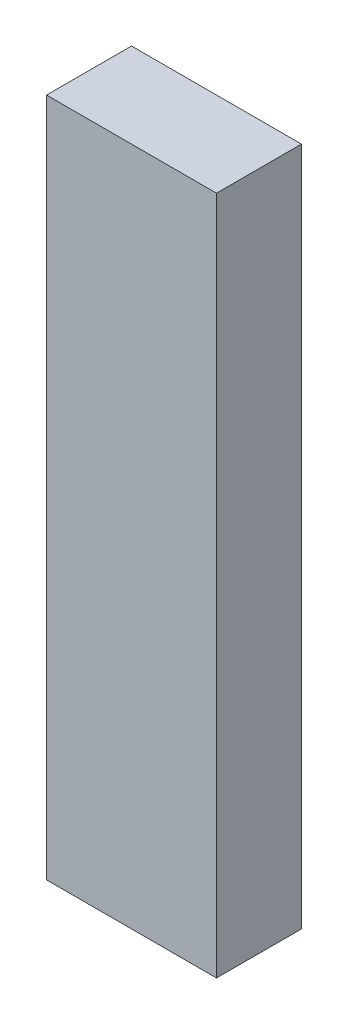
ISO-10303-21;
HEADER;
FILE_DESCRIPTION(('STEP AP214'),'2;1');
FILE_NAME('part.step','',(''),(''),'','','');
FILE_SCHEMA(('AUTOMOTIVE_DESIGN { 1 0 10303 214 1 1 1 1 }'));
ENDSEC;
DATA;
#1=APPLICATION_CONTEXT('core data for automotive mechanical design processes');
#2=APPLICATION_PROTOCOL_DEFINITION('international standard','automotive_design',2000,#1);
#3=PRODUCT_CONTEXT('',#1,'mechanical');
#4=PRODUCT('Part','Part','',(#3));
#5=PRODUCT_RELATED_PRODUCT_CATEGORY('part','',(#4));
#6=PRODUCT_DEFINITION_FORMATION('','',#4);
#7=PRODUCT_DEFINITION_CONTEXT('part definition',#1,'design');
#8=PRODUCT_DEFINITION('design','',#6,#7);
#9=PRODUCT_DEFINITION_SHAPE('','',#8);
#10=(LENGTH_UNIT() NAMED_UNIT(*) SI_UNIT(.MILLI.,.METRE.));
#11=(NAMED_UNIT(*) PLANE_ANGLE_UNIT() SI_UNIT($,.RADIAN.));
#12=(NAMED_UNIT(*) SI_UNIT($,.STERADIAN.) SOLID_ANGLE_UNIT());
#13=UNCERTAINTY_MEASURE_WITH_UNIT(LENGTH_MEASURE(1.E-05),#10,'distance_accuracy_value','');
#14=(GEOMETRIC_REPRESENTATION_CONTEXT(3) GLOBAL_UNCERTAINTY_ASSIGNED_CONTEXT((#13)) GLOBAL_UNIT_ASSIGNED_CONTEXT((#10,
#11,#12)) REPRESENTATION_CONTEXT('',''));
#15=CARTESIAN_POINT('',(0.,0.,0.));
#16=DIRECTION('',(0.,0.,1.));
#17=DIRECTION('',(1.,0.,0.));
#18=AXIS2_PLACEMENT_3D('',#15,#16,#17);
#19=CARTESIAN_POINT('',(0.,0.,5.));
#20=DIRECTION('',(1.,0.,0.));
#21=DIRECTION('',(0.,0.,-1.));
#22=AXIS2_PLACEMENT_3D('',#19,#20,#21);
#23=PLANE('',#22);
#24=DIRECTION('',(0.,-1.,0.));
#25=VECTOR('',#24,1.);
#26=CARTESIAN_POINT('',(0.,0.,0.));
#27=LINE('',#26,#25);
#28=CARTESIAN_POINT('',(0.,40.,0.));
#29=VERTEX_POINT('',#28);
#30=CARTESIAN_POINT('',(0.,0.,0.));
#31=VERTEX_POINT('',#30);
#32=EDGE_CURVE('E96',#29,#31,#27,.T.);
#33=ORIENTED_EDGE('',*,*,#32,.T.);
#34=DIRECTION('',(0.,0.,-1.));
#35=VECTOR('',#34,1.);
#36=CARTESIAN_POINT('',(0.,0.,5.));
#37=LINE('',#36,#35);
#38=CARTESIAN_POINT('',(0.,0.,5.));
#39=VERTEX_POINT('',#38);
#40=EDGE_CURVE('E11',#39,#31,#37,.T.);
#41=ORIENTED_EDGE('',*,*,#40,.F.);
#42=DIRECTION('',(0.,-1.,0.));
#43=VECTOR('',#42,1.);
#44=CARTESIAN_POINT('',(0.,0.,5.));
#45=LINE('',#44,#43);
#46=CARTESIAN_POINT('',(0.,40.,5.));
#47=VERTEX_POINT('',#46);
#48=EDGE_CURVE('E84',#47,#39,#45,.T.);
#49=ORIENTED_EDGE('',*,*,#48,.F.);
#50=DIRECTION('',(0.,0.,-1.));
#51=VECTOR('',#50,1.);
#52=CARTESIAN_POINT('',(0.,40.,5.));
#53=LINE('',#52,#51);
#54=EDGE_CURVE('E92',#47,#29,#53,.T.);
#55=ORIENTED_EDGE('',*,*,#54,.T.);
#56=EDGE_LOOP('',(#33,#41,#49,#55));
#57=FACE_BOUND('',#56,.T.);
#58=ADVANCED_FACE('F33',(#57),#23,.F.);
#59=CARTESIAN_POINT('',(0.,0.,5.));
#60=DIRECTION('',(0.,1.,0.));
#61=DIRECTION('',(0.,0.,1.));
#62=AXIS2_PLACEMENT_3D('',#59,#60,#61);
#63=PLANE('',#62);
#64=DIRECTION('',(1.,0.,0.));
#65=VECTOR('',#64,1.);
#66=CARTESIAN_POINT('',(0.,0.,0.));
#67=LINE('',#66,#65);
#68=CARTESIAN_POINT('',(10.,0.,0.));
#69=VERTEX_POINT('',#68);
#70=EDGE_CURVE('E88',#31,#69,#67,.T.);
#71=ORIENTED_EDGE('',*,*,#70,.T.);
#72=DIRECTION('',(0.,0.,-1.));
#73=VECTOR('',#72,1.);
#74=CARTESIAN_POINT('',(10.,0.,5.));
#75=LINE('',#74,#73);
#76=CARTESIAN_POINT('',(10.,0.,5.));
#77=VERTEX_POINT('',#76);
#78=EDGE_CURVE('E41',#77,#69,#75,.T.);
#79=ORIENTED_EDGE('',*,*,#78,.F.);
#80=DIRECTION('',(1.,0.,0.));
#81=VECTOR('',#80,1.);
#82=CARTESIAN_POINT('',(0.,0.,5.));
#83=LINE('',#82,#81);
#84=EDGE_CURVE('E79',#39,#77,#83,.T.);
#85=ORIENTED_EDGE('',*,*,#84,.F.);
#86=ORIENTED_EDGE('',*,*,#40,.T.);
#87=EDGE_LOOP('',(#71,#79,#85,#86));
#88=FACE_BOUND('',#87,.T.);
#89=ADVANCED_FACE('F87',(#88),#63,.F.);
#90=CARTESIAN_POINT('',(10.,0.,5.));
#91=DIRECTION('',(-1.,0.,0.));
#92=DIRECTION('',(0.,0.,1.));
#93=AXIS2_PLACEMENT_3D('',#90,#91,#92);
#94=PLANE('',#93);
#95=DIRECTION('',(0.,1.,0.));
#96=VECTOR('',#95,1.);
#97=CARTESIAN_POINT('',(10.,0.,0.));
#98=LINE('',#97,#96);
#99=CARTESIAN_POINT('',(10.,40.,0.));
#100=VERTEX_POINT('',#99);
#101=EDGE_CURVE('E66',#69,#100,#98,.T.);
#102=ORIENTED_EDGE('',*,*,#101,.T.);
#103=DIRECTION('',(0.,0.,-1.));
#104=VECTOR('',#103,1.);
#105=CARTESIAN_POINT('',(10.,40.,5.));
#106=LINE('',#105,#104);
#107=CARTESIAN_POINT('',(10.,40.,5.));
#108=VERTEX_POINT('',#107);
#109=EDGE_CURVE('E89',#108,#100,#106,.T.);
#110=ORIENTED_EDGE('',*,*,#109,.F.);
#111=DIRECTION('',(0.,1.,0.));
#112=VECTOR('',#111,1.);
#113=CARTESIAN_POINT('',(10.,0.,5.));
#114=LINE('',#113,#112);
#115=EDGE_CURVE('E82',#77,#108,#114,.T.);
#116=ORIENTED_EDGE('',*,*,#115,.F.);
#117=ORIENTED_EDGE('',*,*,#78,.T.);
#118=EDGE_LOOP('',(#102,#110,#116,#117));
#119=FACE_BOUND('',#118,.T.);
#120=ADVANCED_FACE('F90',(#119),#94,.F.);
#121=CARTESIAN_POINT('',(0.,40.,5.));
#122=DIRECTION('',(0.,-1.,0.));
#123=DIRECTION('',(0.,0.,-1.));
#124=AXIS2_PLACEMENT_3D('',#121,#122,#123);
#125=PLANE('',#124);
#126=DIRECTION('',(-1.,0.,0.));
#127=VECTOR('',#126,1.);
#128=CARTESIAN_POINT('',(0.,40.,0.));
#129=LINE('',#128,#127);
#130=EDGE_CURVE('E72',#100,#29,#129,.T.);
#131=ORIENTED_EDGE('',*,*,#130,.T.);
#132=ORIENTED_EDGE('',*,*,#54,.F.);
#133=DIRECTION('',(-1.,0.,0.));
#134=VECTOR('',#133,1.);
#135=CARTESIAN_POINT('',(0.,40.,5.));
#136=LINE('',#135,#134);
#137=EDGE_CURVE('E49',#108,#47,#136,.T.);
#138=ORIENTED_EDGE('',*,*,#137,.F.);
#139=ORIENTED_EDGE('',*,*,#109,.T.);
#140=EDGE_LOOP('',(#131,#132,#138,#139));
#141=FACE_BOUND('',#140,.T.);
#142=ADVANCED_FACE('F103',(#141),#125,.F.);
#143=CARTESIAN_POINT('',(0.,0.,5.));
#144=DIRECTION('',(0.,0.,-1.));
#145=DIRECTION('',(-1.,0.,0.));
#146=AXIS2_PLACEMENT_3D('',#143,#144,#145);
#147=PLANE('',#146);
#148=ORIENTED_EDGE('',*,*,#48,.T.);
#149=ORIENTED_EDGE('',*,*,#84,.T.);
#150=ORIENTED_EDGE('',*,*,#115,.T.);
#151=ORIENTED_EDGE('',*,*,#137,.T.);
#152=EDGE_LOOP('',(#148,#149,#150,#151));
#153=FACE_BOUND('',#152,.T.);
#154=ADVANCED_FACE('F80',(#153),#147,.F.);
#155=CARTESIAN_POINT('',(0.,0.,0.));
#156=DIRECTION('',(0.,0.,-1.));
#157=DIRECTION('',(-1.,0.,0.));
#158=AXIS2_PLACEMENT_3D('',#155,#156,#157);
#159=PLANE('',#158);
#160=ORIENTED_EDGE('',*,*,#32,.F.);
#161=ORIENTED_EDGE('',*,*,#130,.F.);
#162=ORIENTED_EDGE('',*,*,#101,.F.);
#163=ORIENTED_EDGE('',*,*,#70,.F.);
#164=EDGE_LOOP('',(#160,#161,#162,#163));
#165=FACE_BOUND('',#164,.T.);
#166=ADVANCED_FACE('F106',(#165),#159,.T.);
#167=CLOSED_SHELL('',(#58,#89,#120,#142,#154,#166));
#168=MANIFOLD_SOLID_BREP('B2',#167);
#169=ADVANCED_BREP_SHAPE_REPRESENTATION('',(#18,#168),#14);
#170=SHAPE_DEFINITION_REPRESENTATION(#9,#169);
ENDSEC;
END-ISO-10303-21;
